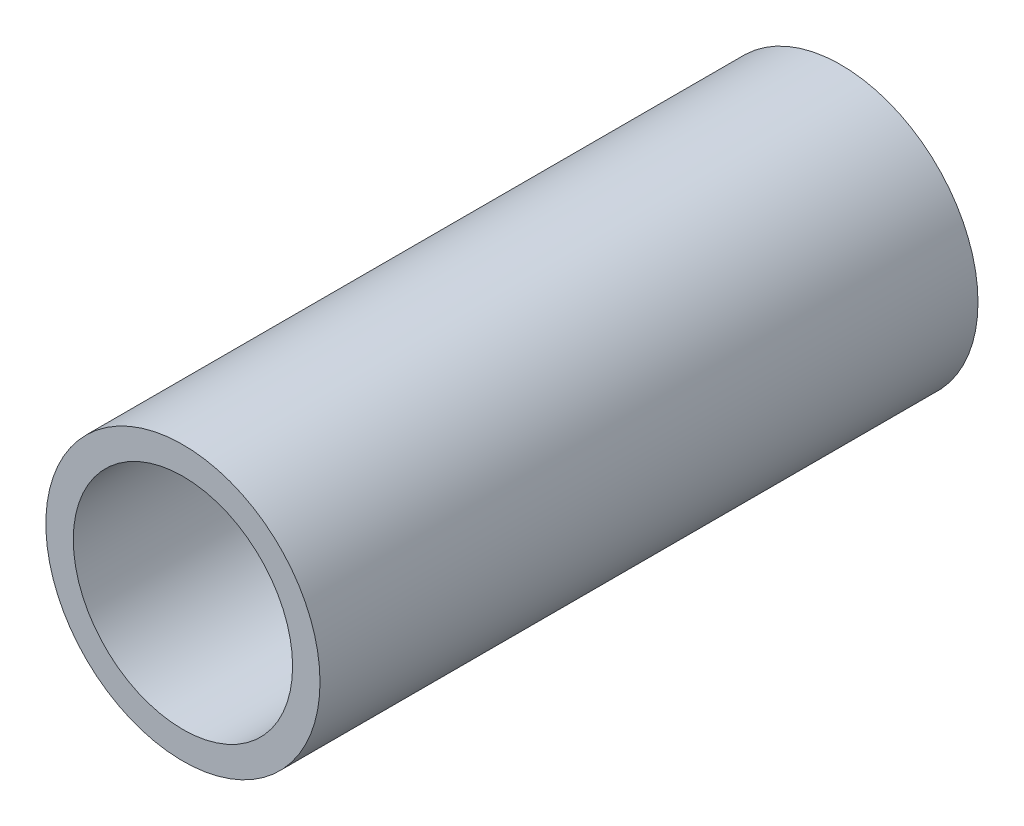
ISO-10303-21;
HEADER;
FILE_DESCRIPTION(('STEP AP214'),'2;1');
FILE_NAME('part.step','',(''),(''),'','','');
FILE_SCHEMA(('AUTOMOTIVE_DESIGN { 1 0 10303 214 1 1 1 1 }'));
ENDSEC;
DATA;
#1=APPLICATION_CONTEXT('core data for automotive mechanical design processes');
#2=APPLICATION_PROTOCOL_DEFINITION('international standard','automotive_design',2000,#1);
#3=PRODUCT_CONTEXT('',#1,'mechanical');
#4=PRODUCT('Part','Part','',(#3));
#5=PRODUCT_RELATED_PRODUCT_CATEGORY('part','',(#4));
#6=PRODUCT_DEFINITION_FORMATION('','',#4);
#7=PRODUCT_DEFINITION_CONTEXT('part definition',#1,'design');
#8=PRODUCT_DEFINITION('design','',#6,#7);
#9=PRODUCT_DEFINITION_SHAPE('','',#8);
#10=(LENGTH_UNIT() NAMED_UNIT(*) SI_UNIT(.MILLI.,.METRE.));
#11=(NAMED_UNIT(*) PLANE_ANGLE_UNIT() SI_UNIT($,.RADIAN.));
#12=(NAMED_UNIT(*) SI_UNIT($,.STERADIAN.) SOLID_ANGLE_UNIT());
#13=UNCERTAINTY_MEASURE_WITH_UNIT(LENGTH_MEASURE(1.E-05),#10,'distance_accuracy_value','');
#14=(GEOMETRIC_REPRESENTATION_CONTEXT(3) GLOBAL_UNCERTAINTY_ASSIGNED_CONTEXT((#13)) GLOBAL_UNIT_ASSIGNED_CONTEXT((#10,
#11,#12)) REPRESENTATION_CONTEXT('',''));
#15=CARTESIAN_POINT('',(0.,0.,0.));
#16=DIRECTION('',(0.,0.,1.));
#17=DIRECTION('',(1.,0.,0.));
#18=AXIS2_PLACEMENT_3D('',#15,#16,#17);
#19=CARTESIAN_POINT('',(0.,0.,24.));
#20=DIRECTION('',(0.,0.,1.));
#21=DIRECTION('',(1.,0.,0.));
#22=AXIS2_PLACEMENT_3D('',#19,#20,#21);
#23=PLANE('',#22);
#24=CARTESIAN_POINT('',(0.,0.,24.));
#25=DIRECTION('',(0.,0.,1.));
#26=DIRECTION('',(1.,0.,0.));
#27=AXIS2_PLACEMENT_3D('',#24,#25,#26);
#28=CIRCLE('',#27,5.);
#29=CARTESIAN_POINT('',(5.,0.,24.));
#30=VERTEX_POINT('',#29);
#31=EDGE_CURVE('E10',#30,#30,#28,.T.);
#32=ORIENTED_EDGE('',*,*,#31,.T.);
#33=EDGE_LOOP('',(#32));
#34=FACE_BOUND('',#33,.T.);
#35=CARTESIAN_POINT('',(0.,0.,24.));
#36=DIRECTION('',(0.,0.,1.));
#37=DIRECTION('',(1.,0.,0.));
#38=AXIS2_PLACEMENT_3D('',#35,#36,#37);
#39=CIRCLE('',#38,4.);
#40=CARTESIAN_POINT('',(4.,0.,24.));
#41=VERTEX_POINT('',#40);
#42=EDGE_CURVE('E46',#41,#41,#39,.T.);
#43=ORIENTED_EDGE('',*,*,#42,.F.);
#44=EDGE_LOOP('',(#43));
#45=FACE_BOUND('',#44,.T.);
#46=ADVANCED_FACE('F35',(#34,#45),#23,.T.);
#47=CARTESIAN_POINT('',(0.,0.,0.));
#48=DIRECTION('',(0.,0.,1.));
#49=DIRECTION('',(1.,0.,0.));
#50=AXIS2_PLACEMENT_3D('',#47,#48,#49);
#51=PLANE('',#50);
#52=CARTESIAN_POINT('',(0.,0.,0.));
#53=DIRECTION('',(0.,0.,1.));
#54=DIRECTION('',(1.,0.,0.));
#55=AXIS2_PLACEMENT_3D('',#52,#53,#54);
#56=CIRCLE('',#55,5.);
#57=CARTESIAN_POINT('',(5.,0.,0.));
#58=VERTEX_POINT('',#57);
#59=EDGE_CURVE('E39',#58,#58,#56,.T.);
#60=ORIENTED_EDGE('',*,*,#59,.F.);
#61=EDGE_LOOP('',(#60));
#62=FACE_BOUND('',#61,.T.);
#63=CARTESIAN_POINT('',(0.,0.,0.));
#64=DIRECTION('',(0.,0.,1.));
#65=DIRECTION('',(1.,0.,0.));
#66=AXIS2_PLACEMENT_3D('',#63,#64,#65);
#67=CIRCLE('',#66,4.);
#68=CARTESIAN_POINT('',(4.,0.,0.));
#69=VERTEX_POINT('',#68);
#70=EDGE_CURVE('E48',#69,#69,#67,.T.);
#71=ORIENTED_EDGE('',*,*,#70,.T.);
#72=EDGE_LOOP('',(#71));
#73=FACE_BOUND('',#72,.T.);
#74=ADVANCED_FACE('F58',(#62,#73),#51,.F.);
#75=CARTESIAN_POINT('',(0.,0.,24.));
#76=DIRECTION('',(0.,0.,-1.));
#77=DIRECTION('',(-1.,0.,0.));
#78=AXIS2_PLACEMENT_3D('',#75,#76,#77);
#79=CYLINDRICAL_SURFACE('',#78,5.);
#80=ORIENTED_EDGE('',*,*,#31,.F.);
#81=EDGE_LOOP('',(#80));
#82=FACE_BOUND('',#81,.T.);
#83=ORIENTED_EDGE('',*,*,#59,.T.);
#84=EDGE_LOOP('',(#83));
#85=FACE_BOUND('',#84,.T.);
#86=ADVANCED_FACE('F37',(#82,#85),#79,.T.);
#87=CARTESIAN_POINT('',(0.,0.,24.));
#88=DIRECTION('',(0.,0.,-1.));
#89=DIRECTION('',(-1.,0.,0.));
#90=AXIS2_PLACEMENT_3D('',#87,#88,#89);
#91=CYLINDRICAL_SURFACE('',#90,4.);
#92=ORIENTED_EDGE('',*,*,#42,.T.);
#93=EDGE_LOOP('',(#92));
#94=FACE_BOUND('',#93,.T.);
#95=ORIENTED_EDGE('',*,*,#70,.F.);
#96=EDGE_LOOP('',(#95));
#97=FACE_BOUND('',#96,.T.);
#98=ADVANCED_FACE('F54',(#94,#97),#91,.F.);
#99=CLOSED_SHELL('',(#46,#74,#86,#98));
#100=MANIFOLD_SOLID_BREP('B2',#99);
#101=ADVANCED_BREP_SHAPE_REPRESENTATION('',(#18,#100),#14);
#102=SHAPE_DEFINITION_REPRESENTATION(#9,#101);
ENDSEC;
END-ISO-10303-21;
